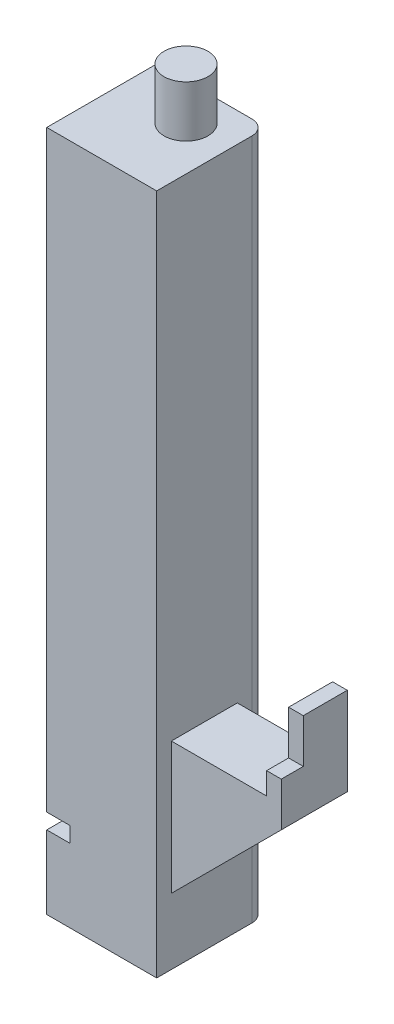
ISO-10303-21;
HEADER;
FILE_DESCRIPTION(('STEP AP214'),'2;1');
FILE_NAME('part.step','',(''),(''),'','','');
FILE_SCHEMA(('AUTOMOTIVE_DESIGN { 1 0 10303 214 1 1 1 1 }'));
ENDSEC;
DATA;
#1=APPLICATION_CONTEXT('core data for automotive mechanical design processes');
#2=APPLICATION_PROTOCOL_DEFINITION('international standard','automotive_design',2000,#1);
#3=PRODUCT_CONTEXT('',#1,'mechanical');
#4=PRODUCT('Part','Part','',(#3));
#5=PRODUCT_RELATED_PRODUCT_CATEGORY('part','',(#4));
#6=PRODUCT_DEFINITION_FORMATION('','',#4);
#7=PRODUCT_DEFINITION_CONTEXT('part definition',#1,'design');
#8=PRODUCT_DEFINITION('design','',#6,#7);
#9=PRODUCT_DEFINITION_SHAPE('','',#8);
#10=(LENGTH_UNIT() NAMED_UNIT(*) SI_UNIT(.MILLI.,.METRE.));
#11=(NAMED_UNIT(*) PLANE_ANGLE_UNIT() SI_UNIT($,.RADIAN.));
#12=(NAMED_UNIT(*) SI_UNIT($,.STERADIAN.) SOLID_ANGLE_UNIT());
#13=UNCERTAINTY_MEASURE_WITH_UNIT(LENGTH_MEASURE(1.E-05),#10,'distance_accuracy_value','');
#14=(GEOMETRIC_REPRESENTATION_CONTEXT(3) GLOBAL_UNCERTAINTY_ASSIGNED_CONTEXT((#13)) GLOBAL_UNIT_ASSIGNED_CONTEXT((#10,
#11,#12)) REPRESENTATION_CONTEXT('',''));
#15=CARTESIAN_POINT('',(0.,0.,0.));
#16=DIRECTION('',(0.,0.,1.));
#17=DIRECTION('',(1.,0.,0.));
#18=AXIS2_PLACEMENT_3D('',#15,#16,#17);
#19=CARTESIAN_POINT('',(7.5,93.,7.5));
#20=DIRECTION('',(-1.,0.,0.));
#21=DIRECTION('',(0.,0.,1.));
#22=AXIS2_PLACEMENT_3D('',#19,#20,#21);
#23=PLANE('',#22);
#24=DIRECTION('',(0.,0.,-1.));
#25=VECTOR('',#24,1.);
#26=CARTESIAN_POINT('',(7.5,0.,7.5));
#27=LINE('',#26,#25);
#28=CARTESIAN_POINT('',(7.5,0.,7.5));
#29=VERTEX_POINT('',#28);
#30=CARTESIAN_POINT('',(7.5,0.,-5.5));
#31=VERTEX_POINT('',#30);
#32=EDGE_CURVE('E249',#29,#31,#27,.T.);
#33=ORIENTED_EDGE('',*,*,#32,.T.);
#34=DIRECTION('',(0.,-1.,0.));
#35=VECTOR('',#34,1.);
#36=CARTESIAN_POINT('',(7.5,93.,-5.5));
#37=LINE('',#36,#35);
#38=CARTESIAN_POINT('',(7.5,93.,-5.5));
#39=VERTEX_POINT('',#38);
#40=EDGE_CURVE('E43',#31,#39,#37,.F.);
#41=ORIENTED_EDGE('',*,*,#40,.T.);
#42=DIRECTION('',(0.,0.,-1.));
#43=VECTOR('',#42,1.);
#44=CARTESIAN_POINT('',(7.5,93.,7.5));
#45=LINE('',#44,#43);
#46=CARTESIAN_POINT('',(7.5,93.,7.5));
#47=VERTEX_POINT('',#46);
#48=EDGE_CURVE('E255',#47,#39,#45,.T.);
#49=ORIENTED_EDGE('',*,*,#48,.F.);
#50=DIRECTION('',(0.,-1.,0.));
#51=VECTOR('',#50,1.);
#52=CARTESIAN_POINT('',(7.5,93.,7.5));
#53=LINE('',#52,#51);
#54=EDGE_CURVE('E265',#47,#29,#53,.T.);
#55=ORIENTED_EDGE('',*,*,#54,.T.);
#56=EDGE_LOOP('',(#33,#41,#49,#55));
#57=FACE_BOUND('',#56,.T.);
#58=DIRECTION('',(0.,0.,1.));
#59=VECTOR('',#58,1.);
#60=CARTESIAN_POINT('',(7.5,8.99999999999984,-24.7132034355965));
#61=LINE('',#60,#59);
#62=CARTESIAN_POINT('',(7.5,8.99999999999984,-3.5));
#63=VERTEX_POINT('',#62);
#64=CARTESIAN_POINT('',(7.5,8.99999999999984,5.5));
#65=VERTEX_POINT('',#64);
#66=EDGE_CURVE('E169',#63,#65,#61,.T.);
#67=ORIENTED_EDGE('',*,*,#66,.T.);
#68=DIRECTION('',(0.,-1.,0.));
#69=VECTOR('',#68,1.);
#70=CARTESIAN_POINT('',(7.5,27.,5.5));
#71=LINE('',#70,#69);
#72=CARTESIAN_POINT('',(7.5,27.,5.5));
#73=VERTEX_POINT('',#72);
#74=EDGE_CURVE('E155',#73,#65,#71,.T.);
#75=ORIENTED_EDGE('',*,*,#74,.F.);
#76=DIRECTION('',(0.,0.,1.));
#77=VECTOR('',#76,1.);
#78=CARTESIAN_POINT('',(7.5,27.,-3.5));
#79=LINE('',#78,#77);
#80=CARTESIAN_POINT('',(7.5,27.,-3.5));
#81=VERTEX_POINT('',#80);
#82=EDGE_CURVE('E50',#81,#73,#79,.T.);
#83=ORIENTED_EDGE('',*,*,#82,.F.);
#84=DIRECTION('',(0.,-1.,0.));
#85=VECTOR('',#84,1.);
#86=CARTESIAN_POINT('',(7.5,27.,-3.5));
#87=LINE('',#86,#85);
#88=EDGE_CURVE('E174',#81,#63,#87,.T.);
#89=ORIENTED_EDGE('',*,*,#88,.T.);
#90=EDGE_LOOP('',(#67,#75,#83,#89));
#91=FACE_BOUND('',#90,.T.);
#92=ADVANCED_FACE('F35',(#57,#91),#23,.F.);
#93=CARTESIAN_POINT('',(0.,0.,2.5));
#94=DIRECTION('',(0.,0.,1.));
#95=DIRECTION('',(1.,0.,0.));
#96=AXIS2_PLACEMENT_3D('',#93,#94,#95);
#97=PLANE('',#96);
#98=DIRECTION('',(0.,-1.,0.));
#99=VECTOR('',#98,1.);
#100=CARTESIAN_POINT('',(20.5,36.,2.5));
#101=LINE('',#100,#99);
#102=CARTESIAN_POINT('',(20.5,36.,2.5));
#103=VERTEX_POINT('',#102);
#104=CARTESIAN_POINT('',(20.5,30.,2.5));
#105=VERTEX_POINT('',#104);
#106=EDGE_CURVE('E58',#103,#105,#101,.T.);
#107=ORIENTED_EDGE('',*,*,#106,.T.);
#108=DIRECTION('',(-1.,0.,0.));
#109=VECTOR('',#108,1.);
#110=CARTESIAN_POINT('',(20.5,30.,2.5));
#111=LINE('',#110,#109);
#112=CARTESIAN_POINT('',(22.5,30.,2.5));
#113=VERTEX_POINT('',#112);
#114=EDGE_CURVE('E178',#113,#105,#111,.T.);
#115=ORIENTED_EDGE('',*,*,#114,.F.);
#116=DIRECTION('',(0.,1.,0.));
#117=VECTOR('',#116,1.);
#118=CARTESIAN_POINT('',(22.5,24.,2.5));
#119=LINE('',#118,#117);
#120=CARTESIAN_POINT('',(22.5,36.,2.5));
#121=VERTEX_POINT('',#120);
#122=EDGE_CURVE('E194',#113,#121,#119,.T.);
#123=ORIENTED_EDGE('',*,*,#122,.T.);
#124=DIRECTION('',(-1.,0.,0.));
#125=VECTOR('',#124,1.);
#126=CARTESIAN_POINT('',(22.5,36.,2.5));
#127=LINE('',#126,#125);
#128=EDGE_CURVE('E208',#121,#103,#127,.T.);
#129=ORIENTED_EDGE('',*,*,#128,.T.);
#130=EDGE_LOOP('',(#107,#115,#123,#129));
#131=FACE_BOUND('',#130,.T.);
#132=ADVANCED_FACE('F340',(#131),#97,.T.);
#133=CARTESIAN_POINT('',(-7.5,93.,7.5));
#134=DIRECTION('',(1.,0.,0.));
#135=DIRECTION('',(0.,0.,-1.));
#136=AXIS2_PLACEMENT_3D('',#133,#134,#135);
#137=PLANE('',#136);
#138=DIRECTION('',(0.,-1.,0.));
#139=VECTOR('',#138,1.);
#140=CARTESIAN_POINT('',(-7.5,93.,-7.5));
#141=LINE('',#140,#139);
#142=CARTESIAN_POINT('',(-7.5,93.,-7.5));
#143=VERTEX_POINT('',#142);
#144=CARTESIAN_POINT('',(-7.5,12.1,-7.5));
#145=VERTEX_POINT('',#144);
#146=EDGE_CURVE('E254',#143,#145,#141,.T.);
#147=ORIENTED_EDGE('',*,*,#146,.T.);
#148=DIRECTION('',(0.,0.,1.));
#149=VECTOR('',#148,1.);
#150=CARTESIAN_POINT('',(-7.5,12.1,-7.5));
#151=LINE('',#150,#149);
#152=CARTESIAN_POINT('',(-7.5,12.1,7.5));
#153=VERTEX_POINT('',#152);
#154=EDGE_CURVE('E238',#145,#153,#151,.T.);
#155=ORIENTED_EDGE('',*,*,#154,.T.);
#156=DIRECTION('',(0.,-1.,0.));
#157=VECTOR('',#156,1.);
#158=CARTESIAN_POINT('',(-7.5,93.,7.5));
#159=LINE('',#158,#157);
#160=CARTESIAN_POINT('',(-7.5,93.,7.5));
#161=VERTEX_POINT('',#160);
#162=EDGE_CURVE('E277',#161,#153,#159,.T.);
#163=ORIENTED_EDGE('',*,*,#162,.F.);
#164=DIRECTION('',(0.,0.,1.));
#165=VECTOR('',#164,1.);
#166=CARTESIAN_POINT('',(-7.5,93.,7.5));
#167=LINE('',#166,#165);
#168=EDGE_CURVE('E261',#143,#161,#167,.T.);
#169=ORIENTED_EDGE('',*,*,#168,.F.);
#170=EDGE_LOOP('',(#147,#155,#163,#169));
#171=FACE_BOUND('',#170,.T.);
#172=ADVANCED_FACE('F325',(#171),#137,.F.);
#173=CARTESIAN_POINT('',(-7.5,93.,-7.5));
#174=DIRECTION('',(0.,0.,1.));
#175=DIRECTION('',(1.,0.,0.));
#176=AXIS2_PLACEMENT_3D('',#173,#174,#175);
#177=PLANE('',#176);
#178=DIRECTION('',(-1.,0.,0.));
#179=VECTOR('',#178,1.);
#180=CARTESIAN_POINT('',(-7.5,93.,-7.5));
#181=LINE('',#180,#179);
#182=CARTESIAN_POINT('',(5.49999999999999,93.,-7.5));
#183=VERTEX_POINT('',#182);
#184=EDGE_CURVE('E258',#183,#143,#181,.T.);
#185=ORIENTED_EDGE('',*,*,#184,.F.);
#186=DIRECTION('',(0.,-1.,0.));
#187=VECTOR('',#186,1.);
#188=CARTESIAN_POINT('',(5.5,93.,-7.5));
#189=LINE('',#188,#187);
#190=CARTESIAN_POINT('',(5.49999999999999,0.,-7.5));
#191=VERTEX_POINT('',#190);
#192=EDGE_CURVE('E253',#183,#191,#189,.T.);
#193=ORIENTED_EDGE('',*,*,#192,.T.);
#194=DIRECTION('',(-1.,0.,0.));
#195=VECTOR('',#194,1.);
#196=CARTESIAN_POINT('',(-7.5,0.,-7.5));
#197=LINE('',#196,#195);
#198=CARTESIAN_POINT('',(-7.5,0.,-7.5));
#199=VERTEX_POINT('',#198);
#200=EDGE_CURVE('E268',#191,#199,#197,.T.);
#201=ORIENTED_EDGE('',*,*,#200,.T.);
#202=CARTESIAN_POINT('',(-7.5,10.,-7.5));
#203=VERTEX_POINT('',#202);
#204=EDGE_CURVE('E280',#203,#199,#141,.T.);
#205=ORIENTED_EDGE('',*,*,#204,.F.);
#206=DIRECTION('',(1.,0.,0.));
#207=VECTOR('',#206,1.);
#208=CARTESIAN_POINT('',(-4.3,10.,-7.5));
#209=LINE('',#208,#207);
#210=CARTESIAN_POINT('',(-4.3,10.,-7.5));
#211=VERTEX_POINT('',#210);
#212=EDGE_CURVE('E221',#203,#211,#209,.T.);
#213=ORIENTED_EDGE('',*,*,#212,.T.);
#214=DIRECTION('',(0.,1.,0.));
#215=VECTOR('',#214,1.);
#216=CARTESIAN_POINT('',(-4.30000000000001,12.1,-7.5));
#217=LINE('',#216,#215);
#218=CARTESIAN_POINT('',(-4.30000000000001,12.1,-7.5));
#219=VERTEX_POINT('',#218);
#220=EDGE_CURVE('E224',#211,#219,#217,.T.);
#221=ORIENTED_EDGE('',*,*,#220,.T.);
#222=DIRECTION('',(-1.,0.,0.));
#223=VECTOR('',#222,1.);
#224=CARTESIAN_POINT('',(-7.5,12.1,-7.5));
#225=LINE('',#224,#223);
#226=EDGE_CURVE('E228',#219,#145,#225,.T.);
#227=ORIENTED_EDGE('',*,*,#226,.T.);
#228=ORIENTED_EDGE('',*,*,#146,.F.);
#229=EDGE_LOOP('',(#185,#193,#201,#205,#213,#221,#227,#228));
#230=FACE_BOUND('',#229,.T.);
#231=ADVANCED_FACE('F300',(#230),#177,.F.);
#232=CARTESIAN_POINT('',(-7.5,10.,7.5));
#233=VERTEX_POINT('',#232);
#234=CARTESIAN_POINT('',(-7.5,0.,7.5));
#235=VERTEX_POINT('',#234);
#236=EDGE_CURVE('E276',#233,#235,#159,.T.);
#237=ORIENTED_EDGE('',*,*,#236,.F.);
#238=DIRECTION('',(0.,0.,1.));
#239=VECTOR('',#238,1.);
#240=CARTESIAN_POINT('',(-7.5,10.,-7.5));
#241=LINE('',#240,#239);
#242=EDGE_CURVE('E231',#203,#233,#241,.T.);
#243=ORIENTED_EDGE('',*,*,#242,.F.);
#244=ORIENTED_EDGE('',*,*,#204,.T.);
#245=DIRECTION('',(0.,0.,1.));
#246=VECTOR('',#245,1.);
#247=CARTESIAN_POINT('',(-7.5,0.,7.5));
#248=LINE('',#247,#246);
#249=EDGE_CURVE('E270',#199,#235,#248,.T.);
#250=ORIENTED_EDGE('',*,*,#249,.T.);
#251=EDGE_LOOP('',(#237,#243,#244,#250));
#252=FACE_BOUND('',#251,.T.);
#253=ADVANCED_FACE('F310',(#252),#137,.F.);
#254=CARTESIAN_POINT('',(-7.5,93.,7.5));
#255=DIRECTION('',(0.,0.,-1.));
#256=DIRECTION('',(-1.,0.,0.));
#257=AXIS2_PLACEMENT_3D('',#254,#255,#256);
#258=PLANE('',#257);
#259=ORIENTED_EDGE('',*,*,#162,.T.);
#260=DIRECTION('',(-1.,0.,0.));
#261=VECTOR('',#260,1.);
#262=CARTESIAN_POINT('',(-7.5,12.1,7.5));
#263=LINE('',#262,#261);
#264=CARTESIAN_POINT('',(-4.30000000000001,12.1,7.5));
#265=VERTEX_POINT('',#264);
#266=EDGE_CURVE('E225',#265,#153,#263,.T.);
#267=ORIENTED_EDGE('',*,*,#266,.F.);
#268=DIRECTION('',(0.,1.,0.));
#269=VECTOR('',#268,1.);
#270=CARTESIAN_POINT('',(-4.30000000000001,12.1,7.5));
#271=LINE('',#270,#269);
#272=CARTESIAN_POINT('',(-4.3,10.,7.5));
#273=VERTEX_POINT('',#272);
#274=EDGE_CURVE('E234',#273,#265,#271,.T.);
#275=ORIENTED_EDGE('',*,*,#274,.F.);
#276=DIRECTION('',(1.,0.,0.));
#277=VECTOR('',#276,1.);
#278=CARTESIAN_POINT('',(-4.3,10.,7.5));
#279=LINE('',#278,#277);
#280=EDGE_CURVE('E212',#233,#273,#279,.T.);
#281=ORIENTED_EDGE('',*,*,#280,.F.);
#282=ORIENTED_EDGE('',*,*,#236,.T.);
#283=DIRECTION('',(1.,0.,0.));
#284=VECTOR('',#283,1.);
#285=CARTESIAN_POINT('',(-7.5,0.,7.5));
#286=LINE('',#285,#284);
#287=EDGE_CURVE('E259',#235,#29,#286,.T.);
#288=ORIENTED_EDGE('',*,*,#287,.T.);
#289=ORIENTED_EDGE('',*,*,#54,.F.);
#290=DIRECTION('',(1.,0.,0.));
#291=VECTOR('',#290,1.);
#292=CARTESIAN_POINT('',(-7.5,93.,7.5));
#293=LINE('',#292,#291);
#294=EDGE_CURVE('E263',#161,#47,#293,.T.);
#295=ORIENTED_EDGE('',*,*,#294,.F.);
#296=EDGE_LOOP('',(#259,#267,#275,#281,#282,#288,#289,#295));
#297=FACE_BOUND('',#296,.T.);
#298=ADVANCED_FACE('F328',(#297),#258,.F.);
#299=CARTESIAN_POINT('',(0.,93.,0.));
#300=DIRECTION('',(0.,-1.,0.));
#301=DIRECTION('',(0.,0.,-1.));
#302=AXIS2_PLACEMENT_3D('',#299,#300,#301);
#303=PLANE('',#302);
#304=CARTESIAN_POINT('',(1.5,93.,-2.5));
#305=DIRECTION('',(0.,1.,0.));
#306=DIRECTION('',(0.,0.,1.));
#307=AXIS2_PLACEMENT_3D('',#304,#305,#306);
#308=CIRCLE('',#307,3.);
#309=CARTESIAN_POINT('',(1.5,93.,0.500000000000004));
#310=VERTEX_POINT('',#309);
#311=EDGE_CURVE('E250',#310,#310,#308,.T.);
#312=ORIENTED_EDGE('',*,*,#311,.F.);
#313=EDGE_LOOP('',(#312));
#314=FACE_BOUND('',#313,.T.);
#315=ORIENTED_EDGE('',*,*,#48,.T.);
#316=CARTESIAN_POINT('',(5.5,93.,-5.5));
#317=DIRECTION('',(0.,-1.,0.));
#318=DIRECTION('',(0.,0.,-1.));
#319=AXIS2_PLACEMENT_3D('',#316,#317,#318);
#320=CIRCLE('',#319,2.);
#321=EDGE_CURVE('E11',#39,#183,#320,.F.);
#322=ORIENTED_EDGE('',*,*,#321,.T.);
#323=ORIENTED_EDGE('',*,*,#184,.T.);
#324=ORIENTED_EDGE('',*,*,#168,.T.);
#325=ORIENTED_EDGE('',*,*,#294,.T.);
#326=EDGE_LOOP('',(#315,#322,#323,#324,#325));
#327=FACE_BOUND('',#326,.T.);
#328=ADVANCED_FACE('F293',(#314,#327),#303,.F.);
#329=CARTESIAN_POINT('',(0.,0.,0.));
#330=DIRECTION('',(0.,-1.,0.));
#331=DIRECTION('',(0.,0.,-1.));
#332=AXIS2_PLACEMENT_3D('',#329,#330,#331);
#333=PLANE('',#332);
#334=ORIENTED_EDGE('',*,*,#200,.F.);
#335=CARTESIAN_POINT('',(5.5,0.,-5.5));
#336=DIRECTION('',(0.,-1.,0.));
#337=DIRECTION('',(0.,0.,-1.));
#338=AXIS2_PLACEMENT_3D('',#335,#336,#337);
#339=CIRCLE('',#338,2.);
#340=EDGE_CURVE('E285',#191,#31,#339,.T.);
#341=ORIENTED_EDGE('',*,*,#340,.T.);
#342=ORIENTED_EDGE('',*,*,#32,.F.);
#343=ORIENTED_EDGE('',*,*,#287,.F.);
#344=ORIENTED_EDGE('',*,*,#249,.F.);
#345=EDGE_LOOP('',(#334,#341,#342,#343,#344));
#346=FACE_BOUND('',#345,.T.);
#347=ADVANCED_FACE('F306',(#346),#333,.T.);
#348=CARTESIAN_POINT('',(1.5,100.,-2.5));
#349=DIRECTION('',(0.,-1.,0.));
#350=DIRECTION('',(0.,0.,-1.));
#351=AXIS2_PLACEMENT_3D('',#348,#349,#350);
#352=CYLINDRICAL_SURFACE('',#351,3.);
#353=CARTESIAN_POINT('',(1.5,100.,-2.5));
#354=DIRECTION('',(0.,1.,0.));
#355=DIRECTION('',(0.,0.,1.));
#356=AXIS2_PLACEMENT_3D('',#353,#354,#355);
#357=CIRCLE('',#356,3.);
#358=CARTESIAN_POINT('',(1.5,100.,0.500000000000004));
#359=VERTEX_POINT('',#358);
#360=EDGE_CURVE('E241',#359,#359,#357,.T.);
#361=ORIENTED_EDGE('',*,*,#360,.F.);
#362=EDGE_LOOP('',(#361));
#363=FACE_BOUND('',#362,.T.);
#364=ORIENTED_EDGE('',*,*,#311,.T.);
#365=EDGE_LOOP('',(#364));
#366=FACE_BOUND('',#365,.T.);
#367=ADVANCED_FACE('F460',(#363,#366),#352,.T.);
#368=CARTESIAN_POINT('',(1.5,100.,-2.5));
#369=DIRECTION('',(0.,1.,0.));
#370=DIRECTION('',(0.,0.,1.));
#371=AXIS2_PLACEMENT_3D('',#368,#369,#370);
#372=PLANE('',#371);
#373=ORIENTED_EDGE('',*,*,#360,.T.);
#374=EDGE_LOOP('',(#373));
#375=FACE_BOUND('',#374,.T.);
#376=ADVANCED_FACE('F453',(#375),#372,.T.);
#377=CARTESIAN_POINT('',(-7.5,12.1,-7.5));
#378=DIRECTION('',(0.,1.,0.));
#379=DIRECTION('',(-1.,0.,0.));
#380=AXIS2_PLACEMENT_3D('',#377,#378,#379);
#381=PLANE('',#380);
#382=ORIENTED_EDGE('',*,*,#266,.T.);
#383=ORIENTED_EDGE('',*,*,#154,.F.);
#384=ORIENTED_EDGE('',*,*,#226,.F.);
#385=DIRECTION('',(0.,0.,1.));
#386=VECTOR('',#385,1.);
#387=CARTESIAN_POINT('',(-4.30000000000001,12.1,-7.5));
#388=LINE('',#387,#386);
#389=EDGE_CURVE('E242',#219,#265,#388,.T.);
#390=ORIENTED_EDGE('',*,*,#389,.T.);
#391=EDGE_LOOP('',(#382,#383,#384,#390));
#392=FACE_BOUND('',#391,.T.);
#393=ADVANCED_FACE('F322',(#392),#381,.F.);
#394=CARTESIAN_POINT('',(-4.30000000000001,12.1,-7.5));
#395=DIRECTION('',(1.,0.,0.));
#396=DIRECTION('',(0.,1.,0.));
#397=AXIS2_PLACEMENT_3D('',#394,#395,#396);
#398=PLANE('',#397);
#399=ORIENTED_EDGE('',*,*,#274,.T.);
#400=ORIENTED_EDGE('',*,*,#389,.F.);
#401=ORIENTED_EDGE('',*,*,#220,.F.);
#402=DIRECTION('',(0.,0.,1.));
#403=VECTOR('',#402,1.);
#404=CARTESIAN_POINT('',(-4.3,10.,-7.5));
#405=LINE('',#404,#403);
#406=EDGE_CURVE('E244',#211,#273,#405,.T.);
#407=ORIENTED_EDGE('',*,*,#406,.T.);
#408=EDGE_LOOP('',(#399,#400,#401,#407));
#409=FACE_BOUND('',#408,.T.);
#410=ADVANCED_FACE('F318',(#409),#398,.F.);
#411=CARTESIAN_POINT('',(-4.3,10.,-7.5));
#412=DIRECTION('',(0.,-1.,0.));
#413=DIRECTION('',(0.,0.,-1.));
#414=AXIS2_PLACEMENT_3D('',#411,#412,#413);
#415=PLANE('',#414);
#416=ORIENTED_EDGE('',*,*,#280,.T.);
#417=ORIENTED_EDGE('',*,*,#406,.F.);
#418=ORIENTED_EDGE('',*,*,#212,.F.);
#419=ORIENTED_EDGE('',*,*,#242,.T.);
#420=EDGE_LOOP('',(#416,#417,#418,#419));
#421=FACE_BOUND('',#420,.T.);
#422=ADVANCED_FACE('F314',(#421),#415,.F.);
#423=CARTESIAN_POINT('',(5.5,93.,-5.5));
#424=DIRECTION('',(0.,-1.,0.));
#425=DIRECTION('',(0.,0.,-1.));
#426=AXIS2_PLACEMENT_3D('',#423,#424,#425);
#427=CYLINDRICAL_SURFACE('',#426,2.);
#428=ORIENTED_EDGE('',*,*,#321,.F.);
#429=ORIENTED_EDGE('',*,*,#40,.F.);
#430=ORIENTED_EDGE('',*,*,#340,.F.);
#431=ORIENTED_EDGE('',*,*,#192,.F.);
#432=EDGE_LOOP('',(#428,#429,#430,#431));
#433=FACE_BOUND('',#432,.T.);
#434=ADVANCED_FACE('F37',(#433),#427,.T.);
#435=CARTESIAN_POINT('',(20.5,27.,-3.5));
#436=DIRECTION('',(0.,1.,0.));
#437=DIRECTION('',(0.,0.,1.));
#438=AXIS2_PLACEMENT_3D('',#435,#436,#437);
#439=PLANE('',#438);
#440=ORIENTED_EDGE('',*,*,#82,.T.);
#441=DIRECTION('',(-1.,0.,0.));
#442=VECTOR('',#441,1.);
#443=CARTESIAN_POINT('',(20.5,27.,5.5));
#444=LINE('',#443,#442);
#445=CARTESIAN_POINT('',(20.5,27.,5.5));
#446=VERTEX_POINT('',#445);
#447=EDGE_CURVE('E161',#446,#73,#444,.T.);
#448=ORIENTED_EDGE('',*,*,#447,.F.);
#449=DIRECTION('',(0.,0.,1.));
#450=VECTOR('',#449,1.);
#451=CARTESIAN_POINT('',(20.5,27.,-3.5));
#452=LINE('',#451,#450);
#453=CARTESIAN_POINT('',(20.5,27.,-3.5));
#454=VERTEX_POINT('',#453);
#455=EDGE_CURVE('E213',#454,#446,#452,.T.);
#456=ORIENTED_EDGE('',*,*,#455,.F.);
#457=DIRECTION('',(-1.,0.,0.));
#458=VECTOR('',#457,1.);
#459=CARTESIAN_POINT('',(20.5,27.,-3.5));
#460=LINE('',#459,#458);
#461=EDGE_CURVE('E205',#454,#81,#460,.T.);
#462=ORIENTED_EDGE('',*,*,#461,.T.);
#463=EDGE_LOOP('',(#440,#448,#456,#462));
#464=FACE_BOUND('',#463,.T.);
#465=ADVANCED_FACE('F372',(#464),#439,.T.);
#466=CARTESIAN_POINT('',(20.5,36.,-3.5));
#467=DIRECTION('',(-1.,0.,0.));
#468=DIRECTION('',(0.,0.,1.));
#469=AXIS2_PLACEMENT_3D('',#466,#467,#468);
#470=PLANE('',#469);
#471=ORIENTED_EDGE('',*,*,#106,.F.);
#472=DIRECTION('',(0.,0.,1.));
#473=VECTOR('',#472,1.);
#474=CARTESIAN_POINT('',(20.5,36.,-3.5));
#475=LINE('',#474,#473);
#476=CARTESIAN_POINT('',(20.5,36.,-3.5));
#477=VERTEX_POINT('',#476);
#478=EDGE_CURVE('E215',#477,#103,#475,.T.);
#479=ORIENTED_EDGE('',*,*,#478,.F.);
#480=DIRECTION('',(0.,-1.,0.));
#481=VECTOR('',#480,1.);
#482=CARTESIAN_POINT('',(20.5,36.,-3.5));
#483=LINE('',#482,#481);
#484=EDGE_CURVE('E202',#477,#454,#483,.T.);
#485=ORIENTED_EDGE('',*,*,#484,.T.);
#486=ORIENTED_EDGE('',*,*,#455,.T.);
#487=DIRECTION('',(0.,-1.,0.));
#488=VECTOR('',#487,1.);
#489=CARTESIAN_POINT('',(20.5,30.,5.5));
#490=LINE('',#489,#488);
#491=CARTESIAN_POINT('',(20.5,30.,5.5));
#492=VERTEX_POINT('',#491);
#493=EDGE_CURVE('E185',#492,#446,#490,.T.);
#494=ORIENTED_EDGE('',*,*,#493,.F.);
#495=DIRECTION('',(0.,0.,-1.));
#496=VECTOR('',#495,1.);
#497=CARTESIAN_POINT('',(20.5,30.,5.5));
#498=LINE('',#497,#496);
#499=EDGE_CURVE('E187',#492,#105,#498,.T.);
#500=ORIENTED_EDGE('',*,*,#499,.T.);
#501=EDGE_LOOP('',(#471,#479,#485,#486,#494,#500));
#502=FACE_BOUND('',#501,.T.);
#503=ADVANCED_FACE('F378',(#502),#470,.T.);
#504=CARTESIAN_POINT('',(22.5,36.,-3.5));
#505=DIRECTION('',(0.,1.,0.));
#506=DIRECTION('',(-1.,0.,0.));
#507=AXIS2_PLACEMENT_3D('',#504,#505,#506);
#508=PLANE('',#507);
#509=ORIENTED_EDGE('',*,*,#128,.F.);
#510=DIRECTION('',(0.,0.,1.));
#511=VECTOR('',#510,1.);
#512=CARTESIAN_POINT('',(22.5,36.,-3.5));
#513=LINE('',#512,#511);
#514=CARTESIAN_POINT('',(22.5,36.,-3.5));
#515=VERTEX_POINT('',#514);
#516=EDGE_CURVE('E217',#515,#121,#513,.T.);
#517=ORIENTED_EDGE('',*,*,#516,.F.);
#518=DIRECTION('',(-1.,0.,0.));
#519=VECTOR('',#518,1.);
#520=CARTESIAN_POINT('',(22.5,36.,-3.5));
#521=LINE('',#520,#519);
#522=EDGE_CURVE('E199',#515,#477,#521,.T.);
#523=ORIENTED_EDGE('',*,*,#522,.T.);
#524=ORIENTED_EDGE('',*,*,#478,.T.);
#525=EDGE_LOOP('',(#509,#517,#523,#524));
#526=FACE_BOUND('',#525,.T.);
#527=ADVANCED_FACE('F390',(#526),#508,.T.);
#528=CARTESIAN_POINT('',(22.5,24.,-3.5));
#529=DIRECTION('',(1.,0.,0.));
#530=DIRECTION('',(0.,1.,0.));
#531=AXIS2_PLACEMENT_3D('',#528,#529,#530);
#532=PLANE('',#531);
#533=ORIENTED_EDGE('',*,*,#122,.F.);
#534=DIRECTION('',(0.,0.,-1.));
#535=VECTOR('',#534,1.);
#536=CARTESIAN_POINT('',(22.5,30.,5.5));
#537=LINE('',#536,#535);
#538=CARTESIAN_POINT('',(22.5,30.,5.5));
#539=VERTEX_POINT('',#538);
#540=EDGE_CURVE('E191',#539,#113,#537,.T.);
#541=ORIENTED_EDGE('',*,*,#540,.F.);
#542=DIRECTION('',(0.,1.,0.));
#543=VECTOR('',#542,1.);
#544=CARTESIAN_POINT('',(22.5,24.,5.5));
#545=LINE('',#544,#543);
#546=CARTESIAN_POINT('',(22.5,24.,5.5));
#547=VERTEX_POINT('',#546);
#548=EDGE_CURVE('E164',#547,#539,#545,.T.);
#549=ORIENTED_EDGE('',*,*,#548,.F.);
#550=DIRECTION('',(0.,0.,1.));
#551=VECTOR('',#550,1.);
#552=CARTESIAN_POINT('',(22.5,24.,-3.5));
#553=LINE('',#552,#551);
#554=CARTESIAN_POINT('',(22.5,24.,-3.5));
#555=VERTEX_POINT('',#554);
#556=EDGE_CURVE('E171',#555,#547,#553,.T.);
#557=ORIENTED_EDGE('',*,*,#556,.F.);
#558=DIRECTION('',(0.,1.,0.));
#559=VECTOR('',#558,1.);
#560=CARTESIAN_POINT('',(22.5,24.,-3.5));
#561=LINE('',#560,#559);
#562=EDGE_CURVE('E196',#555,#515,#561,.T.);
#563=ORIENTED_EDGE('',*,*,#562,.T.);
#564=ORIENTED_EDGE('',*,*,#516,.T.);
#565=EDGE_LOOP('',(#533,#541,#549,#557,#563,#564));
#566=FACE_BOUND('',#565,.T.);
#567=ADVANCED_FACE('F397',(#566),#532,.T.);
#568=CARTESIAN_POINT('',(0.,0.,-3.5));
#569=DIRECTION('',(0.,0.,1.));
#570=DIRECTION('',(1.,0.,0.));
#571=AXIS2_PLACEMENT_3D('',#568,#569,#570);
#572=PLANE('',#571);
#573=ORIENTED_EDGE('',*,*,#88,.F.);
#574=ORIENTED_EDGE('',*,*,#461,.F.);
#575=ORIENTED_EDGE('',*,*,#484,.F.);
#576=ORIENTED_EDGE('',*,*,#522,.F.);
#577=ORIENTED_EDGE('',*,*,#562,.F.);
#578=DIRECTION('',(-0.707106781186544,-0.707106781186551,0.));
#579=VECTOR('',#578,1.);
#580=CARTESIAN_POINT('',(7.5,8.99999999999984,-3.5));
#581=LINE('',#580,#579);
#582=EDGE_CURVE('E176',#555,#63,#581,.T.);
#583=ORIENTED_EDGE('',*,*,#582,.T.);
#584=EDGE_LOOP('',(#573,#574,#575,#576,#577,#583));
#585=FACE_BOUND('',#584,.T.);
#586=ADVANCED_FACE('F403',(#585),#572,.F.);
#587=CARTESIAN_POINT('',(20.5,30.,5.5));
#588=DIRECTION('',(0.,-1.,0.));
#589=DIRECTION('',(0.,0.,-1.));
#590=AXIS2_PLACEMENT_3D('',#587,#588,#589);
#591=PLANE('',#590);
#592=ORIENTED_EDGE('',*,*,#114,.T.);
#593=ORIENTED_EDGE('',*,*,#499,.F.);
#594=DIRECTION('',(-1.,0.,0.));
#595=VECTOR('',#594,1.);
#596=CARTESIAN_POINT('',(20.5,30.,5.5));
#597=LINE('',#596,#595);
#598=EDGE_CURVE('E183',#539,#492,#597,.T.);
#599=ORIENTED_EDGE('',*,*,#598,.F.);
#600=ORIENTED_EDGE('',*,*,#540,.T.);
#601=EDGE_LOOP('',(#592,#593,#599,#600));
#602=FACE_BOUND('',#601,.T.);
#603=ADVANCED_FACE('F411',(#602),#591,.F.);
#604=CARTESIAN_POINT('',(0.,0.,5.5));
#605=DIRECTION('',(0.,0.,1.));
#606=DIRECTION('',(1.,0.,0.));
#607=AXIS2_PLACEMENT_3D('',#604,#605,#606);
#608=PLANE('',#607);
#609=ORIENTED_EDGE('',*,*,#447,.T.);
#610=ORIENTED_EDGE('',*,*,#74,.T.);
#611=DIRECTION('',(0.707106781186544,0.707106781186551,0.));
#612=VECTOR('',#611,1.);
#613=CARTESIAN_POINT('',(7.5,8.99999999999984,5.5));
#614=LINE('',#613,#612);
#615=EDGE_CURVE('E158',#65,#547,#614,.T.);
#616=ORIENTED_EDGE('',*,*,#615,.T.);
#617=ORIENTED_EDGE('',*,*,#548,.T.);
#618=ORIENTED_EDGE('',*,*,#598,.T.);
#619=ORIENTED_EDGE('',*,*,#493,.T.);
#620=EDGE_LOOP('',(#609,#610,#616,#617,#618,#619));
#621=FACE_BOUND('',#620,.T.);
#622=ADVANCED_FACE('F157',(#621),#608,.T.);
#623=CARTESIAN_POINT('',(7.5,8.99999999999984,-24.7132034355965));
#624=DIRECTION('',(0.707106781186551,-0.707106781186544,0.));
#625=DIRECTION('',(0.707106781186544,0.707106781186551,0.));
#626=AXIS2_PLACEMENT_3D('',#623,#624,#625);
#627=PLANE('',#626);
#628=ORIENTED_EDGE('',*,*,#582,.F.);
#629=ORIENTED_EDGE('',*,*,#556,.T.);
#630=ORIENTED_EDGE('',*,*,#615,.F.);
#631=ORIENTED_EDGE('',*,*,#66,.F.);
#632=EDGE_LOOP('',(#628,#629,#630,#631));
#633=FACE_BOUND('',#632,.T.);
#634=ADVANCED_FACE('F168',(#633),#627,.T.);
#635=CLOSED_SHELL('',(#92,#132,#172,#231,#253,#298,#328,#347,#367,#376,#393,#410,#422,#434,#465,
#503,#527,#567,#586,#603,#622,#634));
#636=MANIFOLD_SOLID_BREP('B2',#635);
#637=ADVANCED_BREP_SHAPE_REPRESENTATION('',(#18,#636),#14);
#638=SHAPE_DEFINITION_REPRESENTATION(#9,#637);
ENDSEC;
END-ISO-10303-21;
